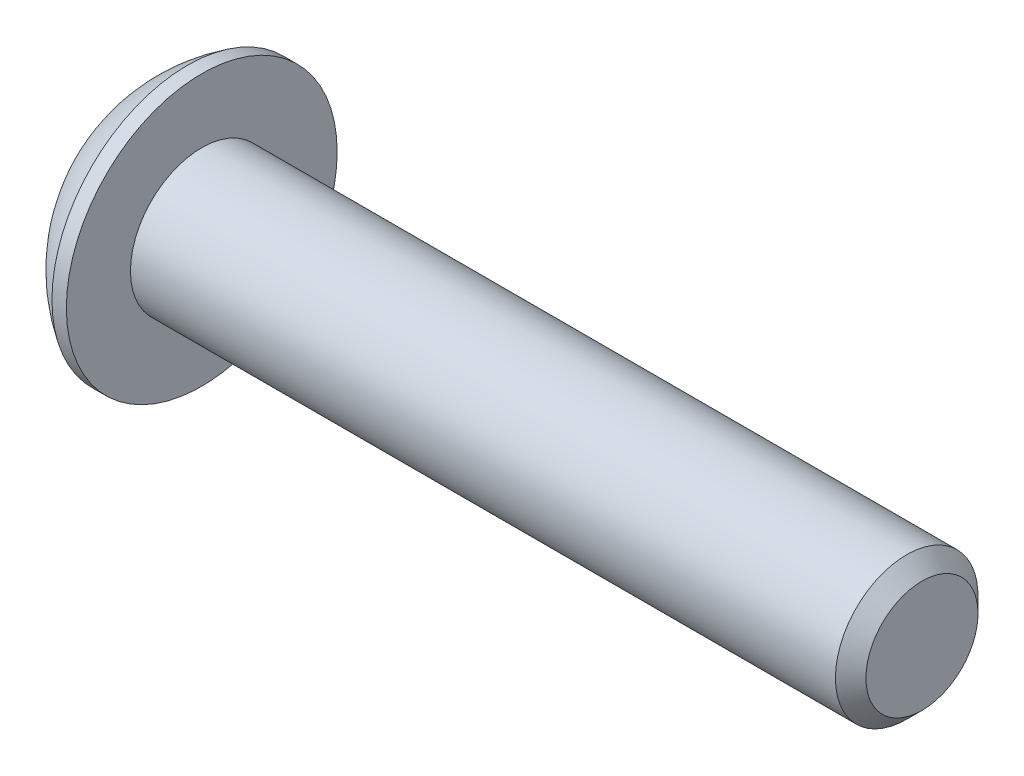
ISO-10303-21;
HEADER;
FILE_DESCRIPTION(('STEP AP214'),'2;1');
FILE_NAME('part.step','',(''),(''),'','','');
FILE_SCHEMA(('AUTOMOTIVE_DESIGN { 1 0 10303 214 1 1 1 1 }'));
ENDSEC;
DATA;
#1=APPLICATION_CONTEXT('core data for automotive mechanical design processes');
#2=APPLICATION_PROTOCOL_DEFINITION('international standard','automotive_design',2000,#1);
#3=PRODUCT_CONTEXT('',#1,'mechanical');
#4=PRODUCT('Part','Part','',(#3));
#5=PRODUCT_RELATED_PRODUCT_CATEGORY('part','',(#4));
#6=PRODUCT_DEFINITION_FORMATION('','',#4);
#7=PRODUCT_DEFINITION_CONTEXT('part definition',#1,'design');
#8=PRODUCT_DEFINITION('design','',#6,#7);
#9=PRODUCT_DEFINITION_SHAPE('','',#8);
#10=(LENGTH_UNIT() NAMED_UNIT(*) SI_UNIT(.MILLI.,.METRE.));
#11=(NAMED_UNIT(*) PLANE_ANGLE_UNIT() SI_UNIT($,.RADIAN.));
#12=(NAMED_UNIT(*) SI_UNIT($,.STERADIAN.) SOLID_ANGLE_UNIT());
#13=UNCERTAINTY_MEASURE_WITH_UNIT(LENGTH_MEASURE(1.E-05),#10,'distance_accuracy_value','');
#14=(GEOMETRIC_REPRESENTATION_CONTEXT(3) GLOBAL_UNCERTAINTY_ASSIGNED_CONTEXT((#13)) GLOBAL_UNIT_ASSIGNED_CONTEXT((#10,
#11,#12)) REPRESENTATION_CONTEXT('',''));
#15=CARTESIAN_POINT('',(0.,0.,0.));
#16=DIRECTION('',(0.,0.,1.));
#17=DIRECTION('',(1.,0.,0.));
#18=AXIS2_PLACEMENT_3D('',#15,#16,#17);
#19=CARTESIAN_POINT('',(0.,0.,0.));
#20=DIRECTION('',(-1.,0.,0.));
#21=DIRECTION('',(0.,0.,1.));
#22=AXIS2_PLACEMENT_3D('',#19,#20,#21);
#23=PLANE('',#22);
#24=CARTESIAN_POINT('',(0.,0.,0.));
#25=DIRECTION('',(-1.,0.,0.));
#26=DIRECTION('',(0.,0.,1.));
#27=AXIS2_PLACEMENT_3D('',#24,#25,#26);
#28=CIRCLE('',#27,1.1938);
#29=CARTESIAN_POINT('',(0.,1.1938,0.));
#30=VERTEX_POINT('',#29);
#31=EDGE_CURVE('E11',#30,#30,#28,.T.);
#32=ORIENTED_EDGE('',*,*,#31,.T.);
#33=EDGE_LOOP('',(#32));
#34=FACE_BOUND('',#33,.T.);
#35=DIRECTION('',(0.,-1.,0.));
#36=VECTOR('',#35,1.);
#37=CARTESIAN_POINT('',(0.,-0.454605601959911,0.787400000000001));
#38=LINE('',#37,#36);
#39=CARTESIAN_POINT('',(0.,0.454605601959914,0.787400000000002));
#40=VERTEX_POINT('',#39);
#41=CARTESIAN_POINT('',(0.,-0.454605601959911,0.787400000000001));
#42=VERTEX_POINT('',#41);
#43=EDGE_CURVE('E53',#40,#42,#38,.T.);
#44=ORIENTED_EDGE('',*,*,#43,.T.);
#45=DIRECTION('',(0.,-0.499999999999998,-0.86602540378444));
#46=VECTOR('',#45,1.);
#47=CARTESIAN_POINT('',(0.,-0.90921120391982,0.));
#48=LINE('',#47,#46);
#49=CARTESIAN_POINT('',(0.,-0.90921120391982,0.));
#50=VERTEX_POINT('',#49);
#51=EDGE_CURVE('E372',#42,#50,#48,.T.);
#52=ORIENTED_EDGE('',*,*,#51,.T.);
#53=DIRECTION('',(0.,0.499999999999999,-0.866025403784439));
#54=VECTOR('',#53,1.);
#55=CARTESIAN_POINT('',(0.,-0.454605601959911,-0.7874));
#56=LINE('',#55,#54);
#57=CARTESIAN_POINT('',(0.,-0.454605601959911,-0.7874));
#58=VERTEX_POINT('',#57);
#59=EDGE_CURVE('E133',#50,#58,#56,.T.);
#60=ORIENTED_EDGE('',*,*,#59,.T.);
#61=DIRECTION('',(0.,1.,0.));
#62=VECTOR('',#61,1.);
#63=CARTESIAN_POINT('',(0.,0.454605601959914,-0.7874));
#64=LINE('',#63,#62);
#65=CARTESIAN_POINT('',(0.,0.454605601959914,-0.7874));
#66=VERTEX_POINT('',#65);
#67=EDGE_CURVE('E375',#58,#66,#64,.T.);
#68=ORIENTED_EDGE('',*,*,#67,.T.);
#69=DIRECTION('',(0.,0.5,0.866025403784439));
#70=VECTOR('',#69,1.);
#71=CARTESIAN_POINT('',(0.,0.909211203919825,0.));
#72=LINE('',#71,#70);
#73=CARTESIAN_POINT('',(0.,0.909211203919825,0.));
#74=VERTEX_POINT('',#73);
#75=EDGE_CURVE('E377',#66,#74,#72,.T.);
#76=ORIENTED_EDGE('',*,*,#75,.T.);
#77=DIRECTION('',(0.,-0.499999999999998,0.86602540378444));
#78=VECTOR('',#77,1.);
#79=CARTESIAN_POINT('',(0.,0.454605601959914,0.787400000000002));
#80=LINE('',#79,#78);
#81=EDGE_CURVE('E379',#74,#40,#80,.T.);
#82=ORIENTED_EDGE('',*,*,#81,.T.);
#83=EDGE_LOOP('',(#44,#52,#60,#68,#76,#82));
#84=FACE_BOUND('',#83,.T.);
#85=ADVANCED_FACE('F39',(#34,#84),#23,.T.);
#86=CARTESIAN_POINT('',(2.53727857142857,0.,0.));
#87=DIRECTION('',(-1.,0.,0.));
#88=DIRECTION('',(0.,1.,0.));
#89=AXIS2_PLACEMENT_3D('',#86,#87,#88);
#90=SPHERICAL_SURFACE('',#89,2.80409361274381);
#91=CARTESIAN_POINT('',(1.0668,0.,0.));
#92=DIRECTION('',(-1.,0.,0.));
#93=DIRECTION('',(0.,0.,1.));
#94=AXIS2_PLACEMENT_3D('',#91,#92,#93);
#95=CIRCLE('',#94,2.3876);
#96=CARTESIAN_POINT('',(1.0668,2.3876,0.));
#97=VERTEX_POINT('',#96);
#98=EDGE_CURVE('E46',#97,#97,#95,.T.);
#99=CARTESIAN_POINT('',(1.0668,2.3876,0.));
#100=CARTESIAN_POINT('',(1.05239959514986,2.37873107877504,0.));
#101=CARTESIAN_POINT('',(1.03807944648218,2.36973184753798,0.));
#102=CARTESIAN_POINT('',(1.0096043070437,2.35147577775036,0.));
#103=CARTESIAN_POINT('',(0.99544931627289,2.3422189391998,0.));
#104=CARTESIAN_POINT('',(0.967309138160108,2.32345066749592,0.));
#105=CARTESIAN_POINT('',(0.953323950818132,2.31393923434259,0.));
#106=CARTESIAN_POINT('',(0.92552795501619,2.29466489209172,0.));
#107=CARTESIAN_POINT('',(0.911717146556223,2.28490198299417,0.));
#108=CARTESIAN_POINT('',(0.884274430764817,2.2651278837873,0.));
#109=CARTESIAN_POINT('',(0.870642523433377,2.25511669367799,0.));
#110=CARTESIAN_POINT('',(0.843562072536132,2.23484931028554,0.));
#111=CARTESIAN_POINT('',(0.830113528970327,2.22459311700241,0.));
#112=CARTESIAN_POINT('',(0.803404208489969,2.20383908487543,0.));
#113=CARTESIAN_POINT('',(0.790143431575416,2.19334124603159,0.));
#114=CARTESIAN_POINT('',(0.763813985736857,2.17210735962349,0.));
#115=CARTESIAN_POINT('',(0.750745316812851,2.16137131205923,0.));
#116=CARTESIAN_POINT('',(0.724804365421771,2.13966452300491,0.));
#117=CARTESIAN_POINT('',(0.711932082954696,2.12869378151484,0.));
#118=CARTESIAN_POINT('',(0.686388118644883,2.1065211962467,0.));
#119=CARTESIAN_POINT('',(0.673716436802143,2.09531935246863,0.));
#120=CARTESIAN_POINT('',(0.648577822236573,2.07268822991904,0.));
#121=CARTESIAN_POINT('',(0.636110889513743,2.06125895114752,0.));
#122=CARTESIAN_POINT('',(0.611385854651764,2.0381767003646,0.));
#123=CARTESIAN_POINT('',(0.599127752512616,2.0265237283532,0.));
#124=CARTESIAN_POINT('',(0.574824391914264,2.00299790607728,0.));
#125=CARTESIAN_POINT('',(0.562779133455059,1.99112505581278,0.));
#126=CARTESIAN_POINT('',(0.538905403631389,1.96716336400193,0.));
#127=CARTESIAN_POINT('',(0.527076932266924,1.95507452245559,0.));
#128=CARTESIAN_POINT('',(0.503640649075091,1.93068480576426,0.));
#129=CARTESIAN_POINT('',(0.492032837247724,1.91838393061926,0.));
#130=CARTESIAN_POINT('',(0.469041673332227,1.89357417383,0.));
#131=CARTESIAN_POINT('',(0.457658321244097,1.88106529218574,0.));
#132=CARTESIAN_POINT('',(0.435119803524877,1.85584361759518,0.));
#133=CARTESIAN_POINT('',(0.423964637893787,1.84313082464889,0.));
#134=CARTESIAN_POINT('',(0.401886145102042,1.81750548940861,0.));
#135=CARTESIAN_POINT('',(0.390962817941387,1.80459294711464,0.));
#136=CARTESIAN_POINT('',(0.369351578203901,1.77857234052793,0.));
#137=CARTESIAN_POINT('',(0.358663665627069,1.76546427623519,0.));
#138=CARTESIAN_POINT('',(0.337526754099839,1.73905691701051,0.));
#139=CARTESIAN_POINT('',(0.327077755149442,1.72575762207855,0.));
#140=CARTESIAN_POINT('',(0.306422091701408,1.69897215554065,0.));
#141=CARTESIAN_POINT('',(0.296215427203771,1.68548598393471,0.));
#142=CARTESIAN_POINT('',(0.276047774151319,1.65833117919434,0.));
#143=CARTESIAN_POINT('',(0.266086785596504,1.64466254605991,0.));
#144=CARTESIAN_POINT('',(0.24641374548976,1.61714729314286,0.));
#145=CARTESIAN_POINT('',(0.236701693937832,1.60330067336024,0.));
#146=CARTESIAN_POINT('',(0.217529707398503,1.5754339802972,0.));
#147=CARTESIAN_POINT('',(0.208069772411104,1.56141390701678,0.));
#148=CARTESIAN_POINT('',(0.189405116026145,1.53320489689316,0.));
#149=CARTESIAN_POINT('',(0.180200394628586,1.51901596004995,0.));
#150=CARTESIAN_POINT('',(0.162049178887077,1.49047386802321,0.));
#151=CARTESIAN_POINT('',(0.153102684543128,1.47612071283968,0.));
#152=CARTESIAN_POINT('',(0.135470851866675,1.4472548831007,0.));
#153=CARTESIAN_POINT('',(0.126785513534171,1.43274220854525,0.));
#154=CARTESIAN_POINT('',(0.109678836216247,1.40356209131596,0.));
#155=CARTESIAN_POINT('',(0.101257497230827,1.38889464864212,0.));
#156=CARTESIAN_POINT('',(0.0846815759769831,1.35940979686978,0.));
#157=CARTESIAN_POINT('',(0.0765269937085597,1.34459238777127,0.));
#158=CARTESIAN_POINT('',(0.0604872541982148,1.31481245479173,0.));
#159=CARTESIAN_POINT('',(0.0526020969562932,1.2998499309107,0.));
#160=CARTESIAN_POINT('',(0.0371037940550261,1.26978466433695,0.));
#161=CARTESIAN_POINT('',(0.0294906483956804,1.25468192164425,0.));
#162=CARTESIAN_POINT('',(0.0145388420852368,1.22434117118901,0.));
#163=CARTESIAN_POINT('',(0.00720018143413873,1.20910316342649,0.));
#164=CARTESIAN_POINT('',(0.,1.1938,0.));
#165=B_SPLINE_CURVE_WITH_KNOTS('',3,(#99,#100,#101,#102,#103,#104,#105,#106,#107,#108,#109,#110,
#111,#112,#113,#114,#115,#116,#117,#118,#119,#120,#121,#122,#123,#124,#125,#126,#127,#128,#129,
#130,#131,#132,#133,#134,#135,#136,#137,#138,#139,#140,#141,#142,#143,#144,#145,#146,#147,#148,
#149,#150,#151,#152,#153,#154,#155,#156,#157,#158,#159,#160,#161,#162,#163,#164),.UNSPECIFIED.,
.F.,.F.,(4,2,2,2,2,2,2,2,2,2,2,2,2,2,2,2,2,2,2,2,2,2,2,2,2,2,2,2,2,2,2,2,4),(0.,
0.0507365202177079,0.101473040435416,0.152209560653124,0.202946080870832,0.25368260108854,
0.304419121306248,0.355155641523956,0.405892161741665,0.456628681959373,0.50736520217708,
0.558101722394789,0.608838242612497,0.659574762830205,0.710311283047913,0.761047803265621,
0.81178432348333,0.862520843701037,0.913257363918746,0.963993884136454,1.01473040435416,
1.06546692457187,1.11620344478958,1.16693996500729,1.21767648522499,1.2684130054427,
1.31914952566041,1.36988604587812,1.42062256609583,1.47135908631353,1.52209560653124,
1.57283212674895,1.62356864696666),.UNSPECIFIED.);
#166=EDGE_CURVE('BSEAM160',#97,#30,#165,.T.);
#167=ORIENTED_EDGE('',*,*,#98,.T.);
#168=ORIENTED_EDGE('',*,*,#31,.F.);
#169=ORIENTED_EDGE('',*,*,#166,.T.);
#170=ORIENTED_EDGE('',*,*,#166,.F.);
#171=EDGE_LOOP('',(#167,#169,#168,#170));
#172=FACE_BOUND('',#171,.T.);
#173=ADVANCED_FACE('F160',(#172),#90,.T.);
#174=CARTESIAN_POINT('',(0.,0.,0.));
#175=DIRECTION('',(-1.,0.,0.));
#176=DIRECTION('',(0.,0.,1.));
#177=AXIS2_PLACEMENT_3D('',#174,#175,#176);
#178=CYLINDRICAL_SURFACE('',#177,2.3876);
#179=ORIENTED_EDGE('',*,*,#98,.F.);
#180=EDGE_LOOP('',(#179));
#181=FACE_BOUND('',#180,.T.);
#182=CARTESIAN_POINT('',(1.3208,0.,0.));
#183=DIRECTION('',(-1.,0.,0.));
#184=DIRECTION('',(0.,0.,1.));
#185=AXIS2_PLACEMENT_3D('',#182,#183,#184);
#186=CIRCLE('',#185,2.3876);
#187=CARTESIAN_POINT('',(1.3208,0.,2.3876));
#188=VERTEX_POINT('',#187);
#189=EDGE_CURVE('E155',#188,#188,#186,.T.);
#190=ORIENTED_EDGE('',*,*,#189,.T.);
#191=EDGE_LOOP('',(#190));
#192=FACE_BOUND('',#191,.T.);
#193=ADVANCED_FACE('F163',(#181,#192),#178,.T.);
#194=CARTESIAN_POINT('',(1.3208,1.2573,0.));
#195=DIRECTION('',(-1.,0.,0.));
#196=DIRECTION('',(0.,0.,1.));
#197=AXIS2_PLACEMENT_3D('',#194,#195,#196);
#198=PLANE('',#197);
#199=ORIENTED_EDGE('',*,*,#189,.F.);
#200=EDGE_LOOP('',(#199));
#201=FACE_BOUND('',#200,.T.);
#202=CARTESIAN_POINT('',(1.3208,0.,0.));
#203=DIRECTION('',(-1.,0.,0.));
#204=DIRECTION('',(0.,0.,1.));
#205=AXIS2_PLACEMENT_3D('',#202,#203,#204);
#206=CIRCLE('',#205,1.2573);
#207=CARTESIAN_POINT('',(1.3208,0.,1.2573));
#208=VERTEX_POINT('',#207);
#209=EDGE_CURVE('E152',#208,#208,#206,.T.);
#210=ORIENTED_EDGE('',*,*,#209,.T.);
#211=EDGE_LOOP('',(#210));
#212=FACE_BOUND('',#211,.T.);
#213=ADVANCED_FACE('F166',(#201,#212),#198,.F.);
#214=CARTESIAN_POINT('',(0.,0.,0.));
#215=DIRECTION('',(-1.,0.,0.));
#216=DIRECTION('',(0.,0.,1.));
#217=AXIS2_PLACEMENT_3D('',#214,#215,#216);
#218=CYLINDRICAL_SURFACE('',#217,1.2573);
#219=ORIENTED_EDGE('',*,*,#209,.F.);
#220=EDGE_LOOP('',(#219));
#221=FACE_BOUND('',#220,.T.);
#222=CARTESIAN_POINT('',(13.75156,0.,0.));
#223=DIRECTION('',(-1.,0.,0.));
#224=DIRECTION('',(0.,0.,1.));
#225=AXIS2_PLACEMENT_3D('',#222,#223,#224);
#226=CIRCLE('',#225,1.2573);
#227=CARTESIAN_POINT('',(13.75156,0.,1.2573));
#228=VERTEX_POINT('',#227);
#229=EDGE_CURVE('E149',#228,#228,#226,.T.);
#230=ORIENTED_EDGE('',*,*,#229,.T.);
#231=EDGE_LOOP('',(#230));
#232=FACE_BOUND('',#231,.T.);
#233=ADVANCED_FACE('F172',(#221,#232),#218,.T.);
#234=CARTESIAN_POINT('',(14.0208,0.,0.));
#235=DIRECTION('',(-1.,0.,0.));
#236=DIRECTION('',(0.,0.,1.));
#237=AXIS2_PLACEMENT_3D('',#234,#235,#236);
#238=CONICAL_SURFACE('',#237,0.98806,0.785398163397451);
#239=ORIENTED_EDGE('',*,*,#229,.F.);
#240=EDGE_LOOP('',(#239));
#241=FACE_BOUND('',#240,.T.);
#242=CARTESIAN_POINT('',(14.0208,0.,0.));
#243=DIRECTION('',(-1.,0.,0.));
#244=DIRECTION('',(0.,0.,1.));
#245=AXIS2_PLACEMENT_3D('',#242,#243,#244);
#246=CIRCLE('',#245,0.98806);
#247=CARTESIAN_POINT('',(14.0208,0.,0.98806));
#248=VERTEX_POINT('',#247);
#249=EDGE_CURVE('E145',#248,#248,#246,.T.);
#250=ORIENTED_EDGE('',*,*,#249,.T.);
#251=EDGE_LOOP('',(#250));
#252=FACE_BOUND('',#251,.T.);
#253=ADVANCED_FACE('F178',(#241,#252),#238,.T.);
#254=CARTESIAN_POINT('',(14.0208,0.,0.));
#255=DIRECTION('',(-1.,0.,0.));
#256=DIRECTION('',(0.,0.,1.));
#257=AXIS2_PLACEMENT_3D('',#254,#255,#256);
#258=PLANE('',#257);
#259=ORIENTED_EDGE('',*,*,#249,.F.);
#260=EDGE_LOOP('',(#259));
#261=FACE_BOUND('',#260,.T.);
#262=ADVANCED_FACE('F184',(#261),#258,.F.);
#263=CARTESIAN_POINT('',(0.889,-0.90921120391982,0.));
#264=DIRECTION('',(0.,0.86602540378444,-0.499999999999998));
#265=DIRECTION('',(0.,0.499999999999998,0.86602540378444));
#266=AXIS2_PLACEMENT_3D('',#263,#264,#265);
#267=PLANE('',#266);
#268=DIRECTION('',(0.,-0.499999999999998,-0.86602540378444));
#269=VECTOR('',#268,1.);
#270=CARTESIAN_POINT('',(0.889,-0.90921120391982,0.));
#271=LINE('',#270,#269);
#272=CARTESIAN_POINT('',(0.889,-0.454605601959911,0.787400000000001));
#273=VERTEX_POINT('',#272);
#274=CARTESIAN_POINT('',(0.889,-0.681908402939867,0.393699999999998));
#275=VERTEX_POINT('',#274);
#276=EDGE_CURVE('E119',#273,#275,#271,.T.);
#277=ORIENTED_EDGE('',*,*,#276,.T.);
#278=CARTESIAN_POINT('',(0.889,-0.90921120391982,0.));
#279=VERTEX_POINT('',#278);
#280=EDGE_CURVE('E114',#275,#279,#271,.T.);
#281=ORIENTED_EDGE('',*,*,#280,.T.);
#282=DIRECTION('',(-1.,0.,0.));
#283=VECTOR('',#282,1.);
#284=CARTESIAN_POINT('',(0.889,-0.90921120391982,0.));
#285=LINE('',#284,#283);
#286=EDGE_CURVE('E116',#279,#50,#285,.T.);
#287=ORIENTED_EDGE('',*,*,#286,.T.);
#288=ORIENTED_EDGE('',*,*,#51,.F.);
#289=DIRECTION('',(-1.,0.,0.));
#290=VECTOR('',#289,1.);
#291=CARTESIAN_POINT('',(0.889,-0.454605601959911,0.787400000000001));
#292=LINE('',#291,#290);
#293=EDGE_CURVE('E367',#273,#42,#292,.T.);
#294=ORIENTED_EDGE('',*,*,#293,.F.);
#295=EDGE_LOOP('',(#277,#281,#287,#288,#294));
#296=FACE_BOUND('',#295,.T.);
#297=ADVANCED_FACE('F115',(#296),#267,.T.);
#298=CARTESIAN_POINT('',(0.889,-0.454605601959911,-0.7874));
#299=DIRECTION('',(0.,0.866025403784439,0.499999999999999));
#300=DIRECTION('',(0.,-0.499999999999999,0.866025403784439));
#301=AXIS2_PLACEMENT_3D('',#298,#299,#300);
#302=PLANE('',#301);
#303=DIRECTION('',(0.,0.499999999999999,-0.866025403784439));
#304=VECTOR('',#303,1.);
#305=CARTESIAN_POINT('',(0.889,-0.454605601959911,-0.7874));
#306=LINE('',#305,#304);
#307=CARTESIAN_POINT('',(0.889,-0.681908402939867,-0.393699999999999));
#308=VERTEX_POINT('',#307);
#309=EDGE_CURVE('E61',#279,#308,#306,.T.);
#310=ORIENTED_EDGE('',*,*,#309,.T.);
#311=CARTESIAN_POINT('',(0.889,-0.454605601959911,-0.7874));
#312=VERTEX_POINT('',#311);
#313=EDGE_CURVE('E128',#308,#312,#306,.T.);
#314=ORIENTED_EDGE('',*,*,#313,.T.);
#315=DIRECTION('',(-1.,0.,0.));
#316=VECTOR('',#315,1.);
#317=CARTESIAN_POINT('',(0.889,-0.454605601959911,-0.7874));
#318=LINE('',#317,#316);
#319=EDGE_CURVE('E135',#312,#58,#318,.T.);
#320=ORIENTED_EDGE('',*,*,#319,.T.);
#321=ORIENTED_EDGE('',*,*,#59,.F.);
#322=ORIENTED_EDGE('',*,*,#286,.F.);
#323=EDGE_LOOP('',(#310,#314,#320,#321,#322));
#324=FACE_BOUND('',#323,.T.);
#325=ADVANCED_FACE('F131',(#324),#302,.T.);
#326=CARTESIAN_POINT('',(0.889,0.454605601959914,-0.7874));
#327=DIRECTION('',(0.,0.,1.));
#328=DIRECTION('',(1.,0.,0.));
#329=AXIS2_PLACEMENT_3D('',#326,#327,#328);
#330=PLANE('',#329);
#331=DIRECTION('',(0.,1.,0.));
#332=VECTOR('',#331,1.);
#333=CARTESIAN_POINT('',(0.889,0.454605601959914,-0.7874));
#334=LINE('',#333,#332);
#335=CARTESIAN_POINT('',(0.889,0.,-0.7874));
#336=VERTEX_POINT('',#335);
#337=EDGE_CURVE('E397',#312,#336,#334,.T.);
#338=ORIENTED_EDGE('',*,*,#337,.T.);
#339=CARTESIAN_POINT('',(0.889,0.454605601959914,-0.7874));
#340=VERTEX_POINT('',#339);
#341=EDGE_CURVE('E127',#336,#340,#334,.T.);
#342=ORIENTED_EDGE('',*,*,#341,.T.);
#343=DIRECTION('',(-1.,0.,0.));
#344=VECTOR('',#343,1.);
#345=CARTESIAN_POINT('',(0.889,0.454605601959914,-0.7874));
#346=LINE('',#345,#344);
#347=EDGE_CURVE('E140',#340,#66,#346,.T.);
#348=ORIENTED_EDGE('',*,*,#347,.T.);
#349=ORIENTED_EDGE('',*,*,#67,.F.);
#350=ORIENTED_EDGE('',*,*,#319,.F.);
#351=EDGE_LOOP('',(#338,#342,#348,#349,#350));
#352=FACE_BOUND('',#351,.T.);
#353=ADVANCED_FACE('F246',(#352),#330,.T.);
#354=CARTESIAN_POINT('',(0.889,0.909211203919825,0.));
#355=DIRECTION('',(0.,-0.866025403784439,0.5));
#356=DIRECTION('',(0.,-0.5,-0.866025403784439));
#357=AXIS2_PLACEMENT_3D('',#354,#355,#356);
#358=PLANE('',#357);
#359=DIRECTION('',(0.,0.5,0.866025403784439));
#360=VECTOR('',#359,1.);
#361=CARTESIAN_POINT('',(0.889,0.909211203919825,0.));
#362=LINE('',#361,#360);
#363=CARTESIAN_POINT('',(0.889,0.681908402939869,-0.393700000000001));
#364=VERTEX_POINT('',#363);
#365=EDGE_CURVE('E401',#340,#364,#362,.T.);
#366=ORIENTED_EDGE('',*,*,#365,.T.);
#367=CARTESIAN_POINT('',(0.889,0.909211203919825,0.));
#368=VERTEX_POINT('',#367);
#369=EDGE_CURVE('E399',#364,#368,#362,.T.);
#370=ORIENTED_EDGE('',*,*,#369,.T.);
#371=DIRECTION('',(-1.,0.,0.));
#372=VECTOR('',#371,1.);
#373=CARTESIAN_POINT('',(0.889,0.909211203919825,0.));
#374=LINE('',#373,#372);
#375=EDGE_CURVE('E383',#368,#74,#374,.T.);
#376=ORIENTED_EDGE('',*,*,#375,.T.);
#377=ORIENTED_EDGE('',*,*,#75,.F.);
#378=ORIENTED_EDGE('',*,*,#347,.F.);
#379=EDGE_LOOP('',(#366,#370,#376,#377,#378));
#380=FACE_BOUND('',#379,.T.);
#381=ADVANCED_FACE('F255',(#380),#358,.T.);
#382=CARTESIAN_POINT('',(0.889,0.454605601959914,0.787400000000002));
#383=DIRECTION('',(0.,-0.86602540378444,-0.499999999999998));
#384=DIRECTION('',(0.,0.499999999999998,-0.86602540378444));
#385=AXIS2_PLACEMENT_3D('',#382,#383,#384);
#386=PLANE('',#385);
#387=DIRECTION('',(0.,-0.499999999999998,0.86602540378444));
#388=VECTOR('',#387,1.);
#389=CARTESIAN_POINT('',(0.889,0.454605601959914,0.787400000000002));
#390=LINE('',#389,#388);
#391=CARTESIAN_POINT('',(0.889,0.68190840293987,0.3937));
#392=VERTEX_POINT('',#391);
#393=EDGE_CURVE('E362',#368,#392,#390,.T.);
#394=ORIENTED_EDGE('',*,*,#393,.T.);
#395=CARTESIAN_POINT('',(0.889,0.454605601959914,0.787400000000002));
#396=VERTEX_POINT('',#395);
#397=EDGE_CURVE('E358',#392,#396,#390,.T.);
#398=ORIENTED_EDGE('',*,*,#397,.T.);
#399=DIRECTION('',(-1.,0.,0.));
#400=VECTOR('',#399,1.);
#401=CARTESIAN_POINT('',(0.889,0.454605601959914,0.787400000000002));
#402=LINE('',#401,#400);
#403=EDGE_CURVE('E366',#396,#40,#402,.T.);
#404=ORIENTED_EDGE('',*,*,#403,.T.);
#405=ORIENTED_EDGE('',*,*,#81,.F.);
#406=ORIENTED_EDGE('',*,*,#375,.F.);
#407=EDGE_LOOP('',(#394,#398,#404,#405,#406));
#408=FACE_BOUND('',#407,.T.);
#409=ADVANCED_FACE('F265',(#408),#386,.T.);
#410=CARTESIAN_POINT('',(0.889,-0.454605601959911,0.787400000000001));
#411=DIRECTION('',(0.,0.,-1.));
#412=DIRECTION('',(0.,1.,0.));
#413=AXIS2_PLACEMENT_3D('',#410,#411,#412);
#414=PLANE('',#413);
#415=DIRECTION('',(0.,-1.,0.));
#416=VECTOR('',#415,1.);
#417=CARTESIAN_POINT('',(0.889,-0.454605601959911,0.787400000000001));
#418=LINE('',#417,#416);
#419=CARTESIAN_POINT('',(0.889,0.,0.787400000000002));
#420=VERTEX_POINT('',#419);
#421=EDGE_CURVE('E357',#396,#420,#418,.T.);
#422=ORIENTED_EDGE('',*,*,#421,.T.);
#423=EDGE_CURVE('E360',#420,#273,#418,.T.);
#424=ORIENTED_EDGE('',*,*,#423,.T.);
#425=ORIENTED_EDGE('',*,*,#293,.T.);
#426=ORIENTED_EDGE('',*,*,#43,.F.);
#427=ORIENTED_EDGE('',*,*,#403,.F.);
#428=EDGE_LOOP('',(#422,#424,#425,#426,#427));
#429=FACE_BOUND('',#428,.T.);
#430=ADVANCED_FACE('F275',(#429),#414,.T.);
#431=CARTESIAN_POINT('',(0.889,-1.36381680587973,-0.7874));
#432=DIRECTION('',(1.,0.,0.));
#433=DIRECTION('',(0.,0.,-1.));
#434=AXIS2_PLACEMENT_3D('',#431,#432,#433);
#435=PLANE('',#434);
#436=CARTESIAN_POINT('',(0.889,0.,0.));
#437=DIRECTION('',(-1.,0.,0.));
#438=DIRECTION('',(0.,0.,1.));
#439=AXIS2_PLACEMENT_3D('',#436,#437,#438);
#440=CIRCLE('',#439,0.7874);
#441=EDGE_CURVE('E404',#364,#336,#440,.T.);
#442=ORIENTED_EDGE('',*,*,#441,.F.);
#443=ORIENTED_EDGE('',*,*,#365,.F.);
#444=ORIENTED_EDGE('',*,*,#341,.F.);
#445=EDGE_LOOP('',(#442,#443,#444));
#446=FACE_BOUND('',#445,.T.);
#447=ADVANCED_FACE('F285',(#446),#435,.F.);
#448=EDGE_CURVE('E146',#392,#364,#440,.T.);
#449=ORIENTED_EDGE('',*,*,#448,.F.);
#450=ORIENTED_EDGE('',*,*,#393,.F.);
#451=ORIENTED_EDGE('',*,*,#369,.F.);
#452=EDGE_LOOP('',(#449,#450,#451));
#453=FACE_BOUND('',#452,.T.);
#454=ADVANCED_FACE('F295',(#453),#435,.F.);
#455=EDGE_CURVE('E139',#420,#392,#440,.T.);
#456=ORIENTED_EDGE('',*,*,#455,.F.);
#457=ORIENTED_EDGE('',*,*,#421,.F.);
#458=ORIENTED_EDGE('',*,*,#397,.F.);
#459=EDGE_LOOP('',(#456,#457,#458));
#460=FACE_BOUND('',#459,.T.);
#461=ADVANCED_FACE('F306',(#460),#435,.F.);
#462=EDGE_CURVE('E134',#275,#420,#440,.T.);
#463=ORIENTED_EDGE('',*,*,#462,.F.);
#464=ORIENTED_EDGE('',*,*,#276,.F.);
#465=ORIENTED_EDGE('',*,*,#423,.F.);
#466=EDGE_LOOP('',(#463,#464,#465));
#467=FACE_BOUND('',#466,.T.);
#468=ADVANCED_FACE('F315',(#467),#435,.F.);
#469=EDGE_CURVE('E125',#308,#275,#440,.T.);
#470=ORIENTED_EDGE('',*,*,#469,.F.);
#471=ORIENTED_EDGE('',*,*,#309,.F.);
#472=ORIENTED_EDGE('',*,*,#280,.F.);
#473=EDGE_LOOP('',(#470,#471,#472));
#474=FACE_BOUND('',#473,.T.);
#475=ADVANCED_FACE('F124',(#474),#435,.F.);
#476=EDGE_CURVE('E398',#336,#308,#440,.T.);
#477=ORIENTED_EDGE('',*,*,#476,.F.);
#478=ORIENTED_EDGE('',*,*,#337,.F.);
#479=ORIENTED_EDGE('',*,*,#313,.F.);
#480=EDGE_LOOP('',(#477,#478,#479));
#481=FACE_BOUND('',#480,.T.);
#482=ADVANCED_FACE('F298',(#481),#435,.F.);
#483=CARTESIAN_POINT('',(1.34360560195992,0.,0.));
#484=DIRECTION('',(-1.,0.,0.));
#485=DIRECTION('',(0.,0.,1.));
#486=AXIS2_PLACEMENT_3D('',#483,#484,#485);
#487=CONICAL_SURFACE('',#486,0.,1.04719755119659);
#488=ORIENTED_EDGE('',*,*,#455,.T.);
#489=ORIENTED_EDGE('',*,*,#448,.T.);
#490=ORIENTED_EDGE('',*,*,#441,.T.);
#491=ORIENTED_EDGE('',*,*,#476,.T.);
#492=ORIENTED_EDGE('',*,*,#469,.T.);
#493=ORIENTED_EDGE('',*,*,#462,.T.);
#494=EDGE_LOOP('',(#488,#489,#490,#491,#492,#493));
#495=FACE_BOUND('',#494,.T.);
#496=CARTESIAN_POINT('',(1.34360560195992,0.,0.));
#497=VERTEX_POINT('',#496);
#498=VERTEX_LOOP('',#497);
#499=FACE_BOUND('',#498,.T.);
#500=ADVANCED_FACE('F339',(#495,#499),#487,.F.);
#501=CLOSED_SHELL('',(#85,#173,#193,#213,#233,#253,#262,#297,#325,#353,#381,#409,#430,#447,#454,
#461,#468,#475,#482,#500));
#502=MANIFOLD_SOLID_BREP('B2',#501);
#503=ADVANCED_BREP_SHAPE_REPRESENTATION('',(#18,#502),#14);
#504=SHAPE_DEFINITION_REPRESENTATION(#9,#503);
ENDSEC;
END-ISO-10303-21;
